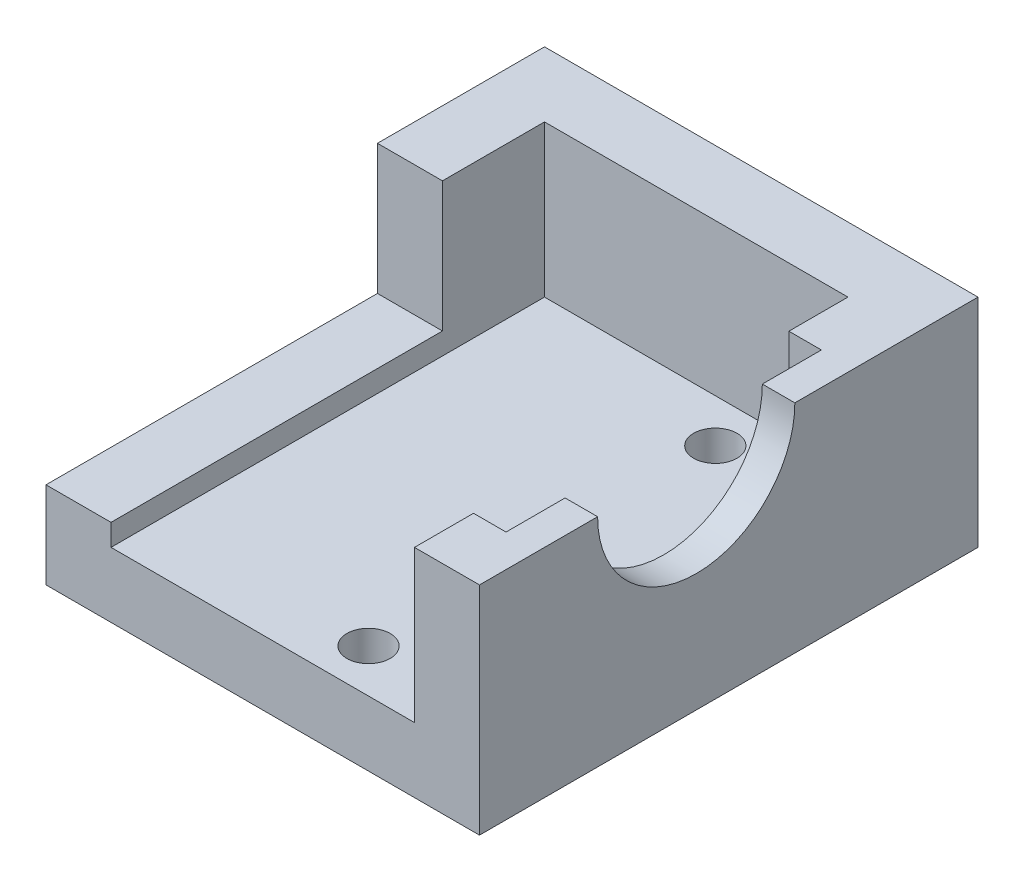
ISO-10303-21;
HEADER;
FILE_DESCRIPTION(('STEP AP214'),'2;1');
FILE_NAME('part.step','',(''),(''),'','','');
FILE_SCHEMA(('AUTOMOTIVE_DESIGN { 1 0 10303 214 1 1 1 1 }'));
ENDSEC;
DATA;
#1=APPLICATION_CONTEXT('core data for automotive mechanical design processes');
#2=APPLICATION_PROTOCOL_DEFINITION('international standard','automotive_design',2000,#1);
#3=PRODUCT_CONTEXT('',#1,'mechanical');
#4=PRODUCT('Part','Part','',(#3));
#5=PRODUCT_RELATED_PRODUCT_CATEGORY('part','',(#4));
#6=PRODUCT_DEFINITION_FORMATION('','',#4);
#7=PRODUCT_DEFINITION_CONTEXT('part definition',#1,'design');
#8=PRODUCT_DEFINITION('design','',#6,#7);
#9=PRODUCT_DEFINITION_SHAPE('','',#8);
#10=(LENGTH_UNIT() NAMED_UNIT(*) SI_UNIT(.MILLI.,.METRE.));
#11=(NAMED_UNIT(*) PLANE_ANGLE_UNIT() SI_UNIT($,.RADIAN.));
#12=(NAMED_UNIT(*) SI_UNIT($,.STERADIAN.) SOLID_ANGLE_UNIT());
#13=UNCERTAINTY_MEASURE_WITH_UNIT(LENGTH_MEASURE(1.E-05),#10,'distance_accuracy_value','');
#14=(GEOMETRIC_REPRESENTATION_CONTEXT(3) GLOBAL_UNCERTAINTY_ASSIGNED_CONTEXT((#13)) GLOBAL_UNIT_ASSIGNED_CONTEXT((#10,
#11,#12)) REPRESENTATION_CONTEXT('',''));
#15=CARTESIAN_POINT('',(0.,0.,0.));
#16=DIRECTION('',(0.,0.,1.));
#17=DIRECTION('',(1.,0.,0.));
#18=AXIS2_PLACEMENT_3D('',#15,#16,#17);
#19=CARTESIAN_POINT('',(-10.,10.,11.5));
#20=DIRECTION('',(1.,0.,0.));
#21=DIRECTION('',(0.,0.,-1.));
#22=AXIS2_PLACEMENT_3D('',#19,#20,#21);
#23=PLANE('',#22);
#24=DIRECTION('',(0.,-1.,0.));
#25=VECTOR('',#24,1.);
#26=CARTESIAN_POINT('',(-10.,10.,-3.79142801931844));
#27=LINE('',#26,#25);
#28=CARTESIAN_POINT('',(-10.,10.,-3.79142801931844));
#29=VERTEX_POINT('',#28);
#30=CARTESIAN_POINT('',(-10.,4.,-3.79142801931843));
#31=VERTEX_POINT('',#30);
#32=EDGE_CURVE('E165',#29,#31,#27,.T.);
#33=ORIENTED_EDGE('',*,*,#32,.F.);
#34=DIRECTION('',(0.,0.,1.));
#35=VECTOR('',#34,1.);
#36=CARTESIAN_POINT('',(-10.,10.,11.5));
#37=LINE('',#36,#35);
#38=CARTESIAN_POINT('',(-10.,10.,-11.5));
#39=VERTEX_POINT('',#38);
#40=EDGE_CURVE('E172',#39,#29,#37,.T.);
#41=ORIENTED_EDGE('',*,*,#40,.F.);
#42=DIRECTION('',(0.,-1.,0.));
#43=VECTOR('',#42,1.);
#44=CARTESIAN_POINT('',(-10.,10.,-11.5));
#45=LINE('',#44,#43);
#46=CARTESIAN_POINT('',(-10.,0.,-11.5));
#47=VERTEX_POINT('',#46);
#48=EDGE_CURVE('E201',#39,#47,#45,.T.);
#49=ORIENTED_EDGE('',*,*,#48,.T.);
#50=DIRECTION('',(0.,0.,1.));
#51=VECTOR('',#50,1.);
#52=CARTESIAN_POINT('',(-10.,0.,11.5));
#53=LINE('',#52,#51);
#54=CARTESIAN_POINT('',(-10.,0.,11.5));
#55=VERTEX_POINT('',#54);
#56=EDGE_CURVE('E204',#47,#55,#53,.T.);
#57=ORIENTED_EDGE('',*,*,#56,.T.);
#58=DIRECTION('',(0.,-1.,0.));
#59=VECTOR('',#58,1.);
#60=CARTESIAN_POINT('',(-10.,10.,11.5));
#61=LINE('',#60,#59);
#62=CARTESIAN_POINT('',(-10.,4.,11.5));
#63=VERTEX_POINT('',#62);
#64=EDGE_CURVE('E221',#63,#55,#61,.T.);
#65=ORIENTED_EDGE('',*,*,#64,.F.);
#66=DIRECTION('',(0.,0.,1.));
#67=VECTOR('',#66,1.);
#68=CARTESIAN_POINT('',(-10.,4.,11.5));
#69=LINE('',#68,#67);
#70=EDGE_CURVE('E168',#31,#63,#69,.T.);
#71=ORIENTED_EDGE('',*,*,#70,.F.);
#72=EDGE_LOOP('',(#33,#41,#49,#57,#65,#71));
#73=FACE_BOUND('',#72,.T.);
#74=ADVANCED_FACE('F44',(#73),#23,.F.);
#75=CARTESIAN_POINT('',(0.,10.,0.));
#76=DIRECTION('',(0.,1.,0.));
#77=DIRECTION('',(0.,0.,1.));
#78=AXIS2_PLACEMENT_3D('',#75,#76,#77);
#79=PLANE('',#78);
#80=DIRECTION('',(0.,0.,-1.));
#81=VECTOR('',#80,1.);
#82=CARTESIAN_POINT('',(8.5,10.,-5.775));
#83=LINE('',#82,#81);
#84=CARTESIAN_POINT('',(8.5,10.,8.775));
#85=VERTEX_POINT('',#84);
#86=CARTESIAN_POINT('',(8.5,10.,6.05));
#87=VERTEX_POINT('',#86);
#88=EDGE_CURVE('E66',#85,#87,#83,.T.);
#89=ORIENTED_EDGE('',*,*,#88,.F.);
#90=DIRECTION('',(-1.,0.,0.));
#91=VECTOR('',#90,1.);
#92=CARTESIAN_POINT('',(8.5,10.,8.775));
#93=LINE('',#92,#91);
#94=CARTESIAN_POINT('',(7.,10.,8.775));
#95=VERTEX_POINT('',#94);
#96=EDGE_CURVE('E272',#85,#95,#93,.T.);
#97=ORIENTED_EDGE('',*,*,#96,.T.);
#98=DIRECTION('',(0.,0.,-1.));
#99=VECTOR('',#98,1.);
#100=CARTESIAN_POINT('',(7.,10.,-8.5));
#101=LINE('',#100,#99);
#102=CARTESIAN_POINT('',(7.,10.,11.5));
#103=VERTEX_POINT('',#102);
#104=EDGE_CURVE('E319',#103,#95,#101,.T.);
#105=ORIENTED_EDGE('',*,*,#104,.F.);
#106=DIRECTION('',(1.,0.,0.));
#107=VECTOR('',#106,1.);
#108=CARTESIAN_POINT('',(10.,10.,11.5));
#109=LINE('',#108,#107);
#110=CARTESIAN_POINT('',(10.,10.,11.5));
#111=VERTEX_POINT('',#110);
#112=EDGE_CURVE('E184',#103,#111,#109,.T.);
#113=ORIENTED_EDGE('',*,*,#112,.T.);
#114=DIRECTION('',(0.,0.,-1.));
#115=VECTOR('',#114,1.);
#116=CARTESIAN_POINT('',(10.,10.,11.5));
#117=LINE('',#116,#115);
#118=CARTESIAN_POINT('',(10.,10.,6.05));
#119=VERTEX_POINT('',#118);
#120=EDGE_CURVE('E197',#111,#119,#117,.T.);
#121=ORIENTED_EDGE('',*,*,#120,.T.);
#122=DIRECTION('',(1.,0.,0.));
#123=VECTOR('',#122,1.);
#124=CARTESIAN_POINT('',(3.,10.,6.05));
#125=LINE('',#124,#123);
#126=EDGE_CURVE('E296',#87,#119,#125,.T.);
#127=ORIENTED_EDGE('',*,*,#126,.F.);
#128=EDGE_LOOP('',(#89,#97,#105,#113,#121,#127));
#129=FACE_BOUND('',#128,.T.);
#130=ADVANCED_FACE('F355',(#129),#79,.T.);
#131=CARTESIAN_POINT('',(7.,3.,-8.5));
#132=DIRECTION('',(1.,0.,0.));
#133=DIRECTION('',(0.,0.,-1.));
#134=AXIS2_PLACEMENT_3D('',#131,#132,#133);
#135=PLANE('',#134);
#136=DIRECTION('',(0.,1.,0.));
#137=VECTOR('',#136,1.);
#138=CARTESIAN_POINT('',(7.,10.,8.775));
#139=LINE('',#138,#137);
#140=CARTESIAN_POINT('',(7.,3.,8.775));
#141=VERTEX_POINT('',#140);
#142=EDGE_CURVE('E254',#141,#95,#139,.T.);
#143=ORIENTED_EDGE('',*,*,#142,.F.);
#144=DIRECTION('',(0.,0.,-1.));
#145=VECTOR('',#144,1.);
#146=CARTESIAN_POINT('',(7.,3.,-8.5));
#147=LINE('',#146,#145);
#148=CARTESIAN_POINT('',(7.,3.,11.5));
#149=VERTEX_POINT('',#148);
#150=EDGE_CURVE('E306',#149,#141,#147,.T.);
#151=ORIENTED_EDGE('',*,*,#150,.F.);
#152=DIRECTION('',(0.,1.,0.));
#153=VECTOR('',#152,1.);
#154=CARTESIAN_POINT('',(7.,3.,11.5));
#155=LINE('',#154,#153);
#156=EDGE_CURVE('E194',#149,#103,#155,.T.);
#157=ORIENTED_EDGE('',*,*,#156,.T.);
#158=ORIENTED_EDGE('',*,*,#104,.T.);
#159=EDGE_LOOP('',(#143,#151,#157,#158));
#160=FACE_BOUND('',#159,.T.);
#161=ADVANCED_FACE('F350',(#160),#135,.F.);
#162=DIRECTION('',(0.,-1.,0.));
#163=VECTOR('',#162,1.);
#164=CARTESIAN_POINT('',(7.,10.,-5.775));
#165=LINE('',#164,#163);
#166=CARTESIAN_POINT('',(7.,10.,-5.775));
#167=VERTEX_POINT('',#166);
#168=CARTESIAN_POINT('',(7.,3.,-5.775));
#169=VERTEX_POINT('',#168);
#170=EDGE_CURVE('E265',#167,#169,#165,.T.);
#171=ORIENTED_EDGE('',*,*,#170,.F.);
#172=CARTESIAN_POINT('',(7.,10.,-8.5));
#173=VERTEX_POINT('',#172);
#174=EDGE_CURVE('E302',#167,#173,#101,.T.);
#175=ORIENTED_EDGE('',*,*,#174,.T.);
#176=DIRECTION('',(0.,1.,0.));
#177=VECTOR('',#176,1.);
#178=CARTESIAN_POINT('',(7.,3.,-8.5));
#179=LINE('',#178,#177);
#180=CARTESIAN_POINT('',(7.,3.,-8.5));
#181=VERTEX_POINT('',#180);
#182=EDGE_CURVE('E333',#181,#173,#179,.T.);
#183=ORIENTED_EDGE('',*,*,#182,.F.);
#184=EDGE_CURVE('E308',#169,#181,#147,.T.);
#185=ORIENTED_EDGE('',*,*,#184,.F.);
#186=EDGE_LOOP('',(#171,#175,#183,#185));
#187=FACE_BOUND('',#186,.T.);
#188=ADVANCED_FACE('F379',(#187),#135,.F.);
#189=CARTESIAN_POINT('',(3.,10.,1.5));
#190=DIRECTION('',(1.,0.,0.));
#191=DIRECTION('',(0.,0.,-1.));
#192=AXIS2_PLACEMENT_3D('',#189,#190,#191);
#193=CYLINDRICAL_SURFACE('',#192,4.55);
#194=CARTESIAN_POINT('',(8.5,10.,1.5));
#195=DIRECTION('',(-1.,0.,0.));
#196=DIRECTION('',(0.,0.,1.));
#197=AXIS2_PLACEMENT_3D('',#194,#195,#196);
#198=CIRCLE('',#197,4.55);
#199=CARTESIAN_POINT('',(8.5,10.,-3.05));
#200=VERTEX_POINT('',#199);
#201=EDGE_CURVE('E230',#87,#200,#198,.F.);
#202=ORIENTED_EDGE('',*,*,#201,.F.);
#203=ORIENTED_EDGE('',*,*,#126,.T.);
#204=CARTESIAN_POINT('',(10.,10.,1.5));
#205=DIRECTION('',(1.,0.,0.));
#206=DIRECTION('',(0.,0.,-1.));
#207=AXIS2_PLACEMENT_3D('',#204,#205,#206);
#208=CIRCLE('',#207,4.55);
#209=CARTESIAN_POINT('',(10.,10.,-3.05));
#210=VERTEX_POINT('',#209);
#211=EDGE_CURVE('E285',#119,#210,#208,.T.);
#212=ORIENTED_EDGE('',*,*,#211,.T.);
#213=DIRECTION('',(1.,0.,0.));
#214=VECTOR('',#213,1.);
#215=CARTESIAN_POINT('',(3.,10.,-3.05));
#216=LINE('',#215,#214);
#217=EDGE_CURVE('E294',#210,#200,#216,.F.);
#218=ORIENTED_EDGE('',*,*,#217,.T.);
#219=EDGE_LOOP('',(#202,#203,#212,#218));
#220=FACE_BOUND('',#219,.T.);
#221=ADVANCED_FACE('F365',(#220),#193,.F.);
#222=CARTESIAN_POINT('',(10.,10.,11.5));
#223=DIRECTION('',(-1.,0.,0.));
#224=DIRECTION('',(0.,0.,1.));
#225=AXIS2_PLACEMENT_3D('',#222,#223,#224);
#226=PLANE('',#225);
#227=ORIENTED_EDGE('',*,*,#211,.F.);
#228=ORIENTED_EDGE('',*,*,#120,.F.);
#229=DIRECTION('',(0.,-1.,0.));
#230=VECTOR('',#229,1.);
#231=CARTESIAN_POINT('',(10.,10.,11.5));
#232=LINE('',#231,#230);
#233=CARTESIAN_POINT('',(10.,0.,11.5));
#234=VERTEX_POINT('',#233);
#235=EDGE_CURVE('E219',#111,#234,#232,.T.);
#236=ORIENTED_EDGE('',*,*,#235,.T.);
#237=DIRECTION('',(0.,0.,-1.));
#238=VECTOR('',#237,1.);
#239=CARTESIAN_POINT('',(10.,0.,11.5));
#240=LINE('',#239,#238);
#241=CARTESIAN_POINT('',(10.,0.,-11.5));
#242=VERTEX_POINT('',#241);
#243=EDGE_CURVE('E192',#234,#242,#240,.T.);
#244=ORIENTED_EDGE('',*,*,#243,.T.);
#245=DIRECTION('',(0.,-1.,0.));
#246=VECTOR('',#245,1.);
#247=CARTESIAN_POINT('',(10.,10.,-11.5));
#248=LINE('',#247,#246);
#249=CARTESIAN_POINT('',(10.,10.,-11.5));
#250=VERTEX_POINT('',#249);
#251=EDGE_CURVE('E216',#250,#242,#248,.T.);
#252=ORIENTED_EDGE('',*,*,#251,.F.);
#253=EDGE_CURVE('E189',#210,#250,#117,.T.);
#254=ORIENTED_EDGE('',*,*,#253,.F.);
#255=EDGE_LOOP('',(#227,#228,#236,#244,#252,#254));
#256=FACE_BOUND('',#255,.T.);
#257=ADVANCED_FACE('F356',(#256),#226,.F.);
#258=CARTESIAN_POINT('',(10.,10.,11.5));
#259=DIRECTION('',(0.,0.,-1.));
#260=DIRECTION('',(-1.,0.,0.));
#261=AXIS2_PLACEMENT_3D('',#258,#259,#260);
#262=PLANE('',#261);
#263=DIRECTION('',(0.,1.,0.));
#264=VECTOR('',#263,1.);
#265=CARTESIAN_POINT('',(-7.,3.,11.5));
#266=LINE('',#265,#264);
#267=CARTESIAN_POINT('',(-7.,3.,11.5));
#268=VERTEX_POINT('',#267);
#269=CARTESIAN_POINT('',(-7.,4.,11.5));
#270=VERTEX_POINT('',#269);
#271=EDGE_CURVE('E207',#268,#270,#266,.T.);
#272=ORIENTED_EDGE('',*,*,#271,.T.);
#273=DIRECTION('',(-1.,0.,0.));
#274=VECTOR('',#273,1.);
#275=CARTESIAN_POINT('',(-4.5,4.,11.5));
#276=LINE('',#275,#274);
#277=EDGE_CURVE('E253',#270,#63,#276,.T.);
#278=ORIENTED_EDGE('',*,*,#277,.T.);
#279=ORIENTED_EDGE('',*,*,#64,.T.);
#280=DIRECTION('',(1.,0.,0.));
#281=VECTOR('',#280,1.);
#282=CARTESIAN_POINT('',(10.,0.,11.5));
#283=LINE('',#282,#281);
#284=EDGE_CURVE('E208',#55,#234,#283,.T.);
#285=ORIENTED_EDGE('',*,*,#284,.T.);
#286=ORIENTED_EDGE('',*,*,#235,.F.);
#287=ORIENTED_EDGE('',*,*,#112,.F.);
#288=ORIENTED_EDGE('',*,*,#156,.F.);
#289=DIRECTION('',(1.,0.,0.));
#290=VECTOR('',#289,1.);
#291=CARTESIAN_POINT('',(0.,3.,11.5));
#292=LINE('',#291,#290);
#293=EDGE_CURVE('E305',#268,#149,#292,.T.);
#294=ORIENTED_EDGE('',*,*,#293,.F.);
#295=EDGE_LOOP('',(#272,#278,#279,#285,#286,#287,#288,#294));
#296=FACE_BOUND('',#295,.T.);
#297=ADVANCED_FACE('F354',(#296),#262,.F.);
#298=CARTESIAN_POINT('',(10.,10.,-11.5));
#299=DIRECTION('',(0.,0.,1.));
#300=DIRECTION('',(1.,0.,0.));
#301=AXIS2_PLACEMENT_3D('',#298,#299,#300);
#302=PLANE('',#301);
#303=DIRECTION('',(-1.,0.,0.));
#304=VECTOR('',#303,1.);
#305=CARTESIAN_POINT('',(10.,0.,-11.5));
#306=LINE('',#305,#304);
#307=EDGE_CURVE('E183',#242,#47,#306,.T.);
#308=ORIENTED_EDGE('',*,*,#307,.T.);
#309=ORIENTED_EDGE('',*,*,#48,.F.);
#310=DIRECTION('',(-1.,0.,0.));
#311=VECTOR('',#310,1.);
#312=CARTESIAN_POINT('',(10.,10.,-11.5));
#313=LINE('',#312,#311);
#314=EDGE_CURVE('E182',#250,#39,#313,.T.);
#315=ORIENTED_EDGE('',*,*,#314,.F.);
#316=ORIENTED_EDGE('',*,*,#251,.T.);
#317=EDGE_LOOP('',(#308,#309,#315,#316));
#318=FACE_BOUND('',#317,.T.);
#319=ADVANCED_FACE('F395',(#318),#302,.F.);
#320=DIRECTION('',(-1.,0.,0.));
#321=VECTOR('',#320,1.);
#322=CARTESIAN_POINT('',(-4.5,10.,-3.79142801931844));
#323=LINE('',#322,#321);
#324=CARTESIAN_POINT('',(-7.,10.,-3.79142801931844));
#325=VERTEX_POINT('',#324);
#326=EDGE_CURVE('E157',#325,#29,#323,.T.);
#327=ORIENTED_EDGE('',*,*,#326,.F.);
#328=DIRECTION('',(0.,0.,1.));
#329=VECTOR('',#328,1.);
#330=CARTESIAN_POINT('',(-7.,10.,11.5));
#331=LINE('',#330,#329);
#332=CARTESIAN_POINT('',(-7.,10.,-8.5));
#333=VERTEX_POINT('',#332);
#334=EDGE_CURVE('E307',#333,#325,#331,.T.);
#335=ORIENTED_EDGE('',*,*,#334,.F.);
#336=DIRECTION('',(-1.,0.,0.));
#337=VECTOR('',#336,1.);
#338=CARTESIAN_POINT('',(-7.,10.,-8.5));
#339=LINE('',#338,#337);
#340=EDGE_CURVE('E322',#173,#333,#339,.T.);
#341=ORIENTED_EDGE('',*,*,#340,.F.);
#342=ORIENTED_EDGE('',*,*,#174,.F.);
#343=DIRECTION('',(-1.,0.,0.));
#344=VECTOR('',#343,1.);
#345=CARTESIAN_POINT('',(8.5,10.,-5.775));
#346=LINE('',#345,#344);
#347=CARTESIAN_POINT('',(8.5,10.,-5.775));
#348=VERTEX_POINT('',#347);
#349=EDGE_CURVE('E287',#348,#167,#346,.T.);
#350=ORIENTED_EDGE('',*,*,#349,.F.);
#351=EDGE_CURVE('E261',#200,#348,#83,.T.);
#352=ORIENTED_EDGE('',*,*,#351,.F.);
#353=ORIENTED_EDGE('',*,*,#217,.F.);
#354=ORIENTED_EDGE('',*,*,#253,.T.);
#355=ORIENTED_EDGE('',*,*,#314,.T.);
#356=ORIENTED_EDGE('',*,*,#40,.T.);
#357=EDGE_LOOP('',(#327,#335,#341,#342,#350,#352,#353,#354,#355,#356));
#358=FACE_BOUND('',#357,.T.);
#359=ADVANCED_FACE('F179',(#358),#79,.T.);
#360=CARTESIAN_POINT('',(0.,0.,0.));
#361=DIRECTION('',(0.,1.,0.));
#362=DIRECTION('',(0.,0.,1.));
#363=AXIS2_PLACEMENT_3D('',#360,#361,#362);
#364=PLANE('',#363);
#365=CARTESIAN_POINT('',(2.88,0.,9.5));
#366=DIRECTION('',(0.,-1.,0.));
#367=DIRECTION('',(0.,0.,-1.));
#368=AXIS2_PLACEMENT_3D('',#365,#366,#367);
#369=CIRCLE('',#368,1.);
#370=CARTESIAN_POINT('',(2.88,0.,8.49999999999999));
#371=VERTEX_POINT('',#370);
#372=EDGE_CURVE('E234',#371,#371,#369,.T.);
#373=ORIENTED_EDGE('',*,*,#372,.F.);
#374=EDGE_LOOP('',(#373));
#375=FACE_BOUND('',#374,.T.);
#376=CARTESIAN_POINT('',(2.88,0.,-6.5));
#377=DIRECTION('',(0.,-1.,0.));
#378=DIRECTION('',(0.,0.,-1.));
#379=AXIS2_PLACEMENT_3D('',#376,#377,#378);
#380=CIRCLE('',#379,1.);
#381=CARTESIAN_POINT('',(2.88,0.,-7.5));
#382=VERTEX_POINT('',#381);
#383=EDGE_CURVE('E243',#382,#382,#380,.T.);
#384=ORIENTED_EDGE('',*,*,#383,.F.);
#385=EDGE_LOOP('',(#384));
#386=FACE_BOUND('',#385,.T.);
#387=ORIENTED_EDGE('',*,*,#56,.F.);
#388=ORIENTED_EDGE('',*,*,#307,.F.);
#389=ORIENTED_EDGE('',*,*,#243,.F.);
#390=ORIENTED_EDGE('',*,*,#284,.F.);
#391=EDGE_LOOP('',(#387,#388,#389,#390));
#392=FACE_BOUND('',#391,.T.);
#393=ADVANCED_FACE('F386',(#375,#386,#392),#364,.F.);
#394=CARTESIAN_POINT('',(-7.,3.,11.5));
#395=DIRECTION('',(-1.,0.,0.));
#396=DIRECTION('',(0.,0.,1.));
#397=AXIS2_PLACEMENT_3D('',#394,#395,#396);
#398=PLANE('',#397);
#399=DIRECTION('',(0.,-1.,0.));
#400=VECTOR('',#399,1.);
#401=CARTESIAN_POINT('',(-7.,2.99999999999999,-3.79142801931843));
#402=LINE('',#401,#400);
#403=CARTESIAN_POINT('',(-7.,4.,-3.79142801931843));
#404=VERTEX_POINT('',#403);
#405=EDGE_CURVE('E53',#325,#404,#402,.T.);
#406=ORIENTED_EDGE('',*,*,#405,.T.);
#407=DIRECTION('',(0.,0.,1.));
#408=VECTOR('',#407,1.);
#409=CARTESIAN_POINT('',(-7.,4.,11.5));
#410=LINE('',#409,#408);
#411=EDGE_CURVE('E11',#404,#270,#410,.T.);
#412=ORIENTED_EDGE('',*,*,#411,.T.);
#413=ORIENTED_EDGE('',*,*,#271,.F.);
#414=DIRECTION('',(0.,0.,1.));
#415=VECTOR('',#414,1.);
#416=CARTESIAN_POINT('',(-7.,3.,11.5));
#417=LINE('',#416,#415);
#418=CARTESIAN_POINT('',(-7.,3.,-8.5));
#419=VERTEX_POINT('',#418);
#420=EDGE_CURVE('E316',#419,#268,#417,.T.);
#421=ORIENTED_EDGE('',*,*,#420,.F.);
#422=DIRECTION('',(0.,1.,0.));
#423=VECTOR('',#422,1.);
#424=CARTESIAN_POINT('',(-7.,3.,-8.5));
#425=LINE('',#424,#423);
#426=EDGE_CURVE('E334',#419,#333,#425,.T.);
#427=ORIENTED_EDGE('',*,*,#426,.T.);
#428=ORIENTED_EDGE('',*,*,#334,.T.);
#429=EDGE_LOOP('',(#406,#412,#413,#421,#427,#428));
#430=FACE_BOUND('',#429,.T.);
#431=ADVANCED_FACE('F383',(#430),#398,.F.);
#432=CARTESIAN_POINT('',(-7.,3.,-8.5));
#433=DIRECTION('',(0.,0.,-1.));
#434=DIRECTION('',(-1.,0.,0.));
#435=AXIS2_PLACEMENT_3D('',#432,#433,#434);
#436=PLANE('',#435);
#437=ORIENTED_EDGE('',*,*,#340,.T.);
#438=ORIENTED_EDGE('',*,*,#426,.F.);
#439=DIRECTION('',(-1.,0.,0.));
#440=VECTOR('',#439,1.);
#441=CARTESIAN_POINT('',(-7.,3.,-8.5));
#442=LINE('',#441,#440);
#443=EDGE_CURVE('E315',#181,#419,#442,.T.);
#444=ORIENTED_EDGE('',*,*,#443,.F.);
#445=ORIENTED_EDGE('',*,*,#182,.T.);
#446=EDGE_LOOP('',(#437,#438,#444,#445));
#447=FACE_BOUND('',#446,.T.);
#448=ADVANCED_FACE('F381',(#447),#436,.F.);
#449=CARTESIAN_POINT('',(0.,3.,0.));
#450=DIRECTION('',(0.,-1.,0.));
#451=DIRECTION('',(0.,0.,-1.));
#452=AXIS2_PLACEMENT_3D('',#449,#450,#451);
#453=PLANE('',#452);
#454=CARTESIAN_POINT('',(2.88,3.,9.5));
#455=DIRECTION('',(0.,-1.,0.));
#456=DIRECTION('',(0.,0.,-1.));
#457=AXIS2_PLACEMENT_3D('',#454,#455,#456);
#458=CIRCLE('',#457,1.);
#459=CARTESIAN_POINT('',(2.88,3.,8.49999999999999));
#460=VERTEX_POINT('',#459);
#461=EDGE_CURVE('E48',#460,#460,#458,.T.);
#462=ORIENTED_EDGE('',*,*,#461,.T.);
#463=EDGE_LOOP('',(#462));
#464=FACE_BOUND('',#463,.T.);
#465=CARTESIAN_POINT('',(2.88,3.,-6.5));
#466=DIRECTION('',(0.,-1.,0.));
#467=DIRECTION('',(0.,0.,-1.));
#468=AXIS2_PLACEMENT_3D('',#465,#466,#467);
#469=CIRCLE('',#468,1.);
#470=CARTESIAN_POINT('',(2.88,3.,-7.5));
#471=VERTEX_POINT('',#470);
#472=EDGE_CURVE('E232',#471,#471,#469,.T.);
#473=ORIENTED_EDGE('',*,*,#472,.T.);
#474=EDGE_LOOP('',(#473));
#475=FACE_BOUND('',#474,.T.);
#476=ORIENTED_EDGE('',*,*,#293,.T.);
#477=ORIENTED_EDGE('',*,*,#150,.T.);
#478=DIRECTION('',(-1.,0.,0.));
#479=VECTOR('',#478,1.);
#480=CARTESIAN_POINT('',(8.5,3.,8.775));
#481=LINE('',#480,#479);
#482=CARTESIAN_POINT('',(8.5,3.,8.775));
#483=VERTEX_POINT('',#482);
#484=EDGE_CURVE('E276',#483,#141,#481,.T.);
#485=ORIENTED_EDGE('',*,*,#484,.F.);
#486=DIRECTION('',(0.,0.,1.));
#487=VECTOR('',#486,1.);
#488=CARTESIAN_POINT('',(8.5,3.,-5.775));
#489=LINE('',#488,#487);
#490=CARTESIAN_POINT('',(8.5,3.,-5.775));
#491=VERTEX_POINT('',#490);
#492=EDGE_CURVE('E267',#491,#483,#489,.T.);
#493=ORIENTED_EDGE('',*,*,#492,.F.);
#494=DIRECTION('',(-1.,0.,0.));
#495=VECTOR('',#494,1.);
#496=CARTESIAN_POINT('',(8.5,3.,-5.775));
#497=LINE('',#496,#495);
#498=EDGE_CURVE('E281',#491,#169,#497,.T.);
#499=ORIENTED_EDGE('',*,*,#498,.T.);
#500=ORIENTED_EDGE('',*,*,#184,.T.);
#501=ORIENTED_EDGE('',*,*,#443,.T.);
#502=ORIENTED_EDGE('',*,*,#420,.T.);
#503=EDGE_LOOP('',(#476,#477,#485,#493,#499,#500,#501,#502));
#504=FACE_BOUND('',#503,.T.);
#505=ADVANCED_FACE('F376',(#464,#475,#504),#453,.F.);
#506=CARTESIAN_POINT('',(8.5,0.,0.));
#507=DIRECTION('',(-1.,0.,0.));
#508=DIRECTION('',(0.,0.,1.));
#509=AXIS2_PLACEMENT_3D('',#506,#507,#508);
#510=PLANE('',#509);
#511=ORIENTED_EDGE('',*,*,#201,.T.);
#512=ORIENTED_EDGE('',*,*,#351,.T.);
#513=DIRECTION('',(0.,-1.,0.));
#514=VECTOR('',#513,1.);
#515=CARTESIAN_POINT('',(8.5,10.,-5.775));
#516=LINE('',#515,#514);
#517=EDGE_CURVE('E264',#348,#491,#516,.T.);
#518=ORIENTED_EDGE('',*,*,#517,.T.);
#519=ORIENTED_EDGE('',*,*,#492,.T.);
#520=DIRECTION('',(0.,1.,0.));
#521=VECTOR('',#520,1.);
#522=CARTESIAN_POINT('',(8.5,10.,8.775));
#523=LINE('',#522,#521);
#524=EDGE_CURVE('E256',#483,#85,#523,.T.);
#525=ORIENTED_EDGE('',*,*,#524,.T.);
#526=ORIENTED_EDGE('',*,*,#88,.T.);
#527=EDGE_LOOP('',(#511,#512,#518,#519,#525,#526));
#528=FACE_BOUND('',#527,.T.);
#529=ADVANCED_FACE('F370',(#528),#510,.T.);
#530=CARTESIAN_POINT('',(8.5,10.,8.775));
#531=DIRECTION('',(0.,0.,1.));
#532=DIRECTION('',(1.,0.,0.));
#533=AXIS2_PLACEMENT_3D('',#530,#531,#532);
#534=PLANE('',#533);
#535=ORIENTED_EDGE('',*,*,#142,.T.);
#536=ORIENTED_EDGE('',*,*,#96,.F.);
#537=ORIENTED_EDGE('',*,*,#524,.F.);
#538=ORIENTED_EDGE('',*,*,#484,.T.);
#539=EDGE_LOOP('',(#535,#536,#537,#538));
#540=FACE_BOUND('',#539,.T.);
#541=ADVANCED_FACE('F445',(#540),#534,.F.);
#542=CARTESIAN_POINT('',(8.5,10.,-5.775));
#543=DIRECTION('',(0.,0.,-1.));
#544=DIRECTION('',(-1.,0.,0.));
#545=AXIS2_PLACEMENT_3D('',#542,#543,#544);
#546=PLANE('',#545);
#547=ORIENTED_EDGE('',*,*,#170,.T.);
#548=ORIENTED_EDGE('',*,*,#498,.F.);
#549=ORIENTED_EDGE('',*,*,#517,.F.);
#550=ORIENTED_EDGE('',*,*,#349,.T.);
#551=EDGE_LOOP('',(#547,#548,#549,#550));
#552=FACE_BOUND('',#551,.T.);
#553=ADVANCED_FACE('F437',(#552),#546,.F.);
#554=CARTESIAN_POINT('',(-4.5,4.,11.5));
#555=DIRECTION('',(0.,-1.,0.));
#556=DIRECTION('',(0.,0.,-1.));
#557=AXIS2_PLACEMENT_3D('',#554,#555,#556);
#558=PLANE('',#557);
#559=DIRECTION('',(-1.,0.,0.));
#560=VECTOR('',#559,1.);
#561=CARTESIAN_POINT('',(-4.5,4.,-3.79142801931843));
#562=LINE('',#561,#560);
#563=EDGE_CURVE('E65',#404,#31,#562,.T.);
#564=ORIENTED_EDGE('',*,*,#563,.T.);
#565=ORIENTED_EDGE('',*,*,#70,.T.);
#566=ORIENTED_EDGE('',*,*,#277,.F.);
#567=ORIENTED_EDGE('',*,*,#411,.F.);
#568=EDGE_LOOP('',(#564,#565,#566,#567));
#569=FACE_BOUND('',#568,.T.);
#570=ADVANCED_FACE('F432',(#569),#558,.F.);
#571=CARTESIAN_POINT('',(-4.5,10.,-3.79142801931844));
#572=DIRECTION('',(0.,0.,-1.));
#573=DIRECTION('',(0.,1.,0.));
#574=AXIS2_PLACEMENT_3D('',#571,#572,#573);
#575=PLANE('',#574);
#576=ORIENTED_EDGE('',*,*,#326,.T.);
#577=ORIENTED_EDGE('',*,*,#32,.T.);
#578=ORIENTED_EDGE('',*,*,#563,.F.);
#579=ORIENTED_EDGE('',*,*,#405,.F.);
#580=EDGE_LOOP('',(#576,#577,#578,#579));
#581=FACE_BOUND('',#580,.T.);
#582=ADVANCED_FACE('F161',(#581),#575,.F.);
#583=CARTESIAN_POINT('',(2.88,5.5,-6.5));
#584=DIRECTION('',(0.,-1.,0.));
#585=DIRECTION('',(0.,0.,-1.));
#586=AXIS2_PLACEMENT_3D('',#583,#584,#585);
#587=CYLINDRICAL_SURFACE('',#586,1.);
#588=ORIENTED_EDGE('',*,*,#383,.T.);
#589=EDGE_LOOP('',(#588));
#590=FACE_BOUND('',#589,.T.);
#591=ORIENTED_EDGE('',*,*,#472,.F.);
#592=EDGE_LOOP('',(#591));
#593=FACE_BOUND('',#592,.T.);
#594=ADVANCED_FACE('F422',(#590,#593),#587,.F.);
#595=CARTESIAN_POINT('',(2.88,5.5,9.5));
#596=DIRECTION('',(0.,-1.,0.));
#597=DIRECTION('',(0.,0.,-1.));
#598=AXIS2_PLACEMENT_3D('',#595,#596,#597);
#599=CYLINDRICAL_SURFACE('',#598,1.);
#600=ORIENTED_EDGE('',*,*,#372,.T.);
#601=EDGE_LOOP('',(#600));
#602=FACE_BOUND('',#601,.T.);
#603=ORIENTED_EDGE('',*,*,#461,.F.);
#604=EDGE_LOOP('',(#603));
#605=FACE_BOUND('',#604,.T.);
#606=ADVANCED_FACE('F428',(#602,#605),#599,.F.);
#607=CLOSED_SHELL('',(#74,#130,#161,#188,#221,#257,#297,#319,#359,#393,#431,#448,#505,#529,#541,
#553,#570,#582,#594,#606));
#608=MANIFOLD_SOLID_BREP('B2',#607);
#609=ADVANCED_BREP_SHAPE_REPRESENTATION('',(#18,#608),#14);
#610=SHAPE_DEFINITION_REPRESENTATION(#9,#609);
ENDSEC;
END-ISO-10303-21;
